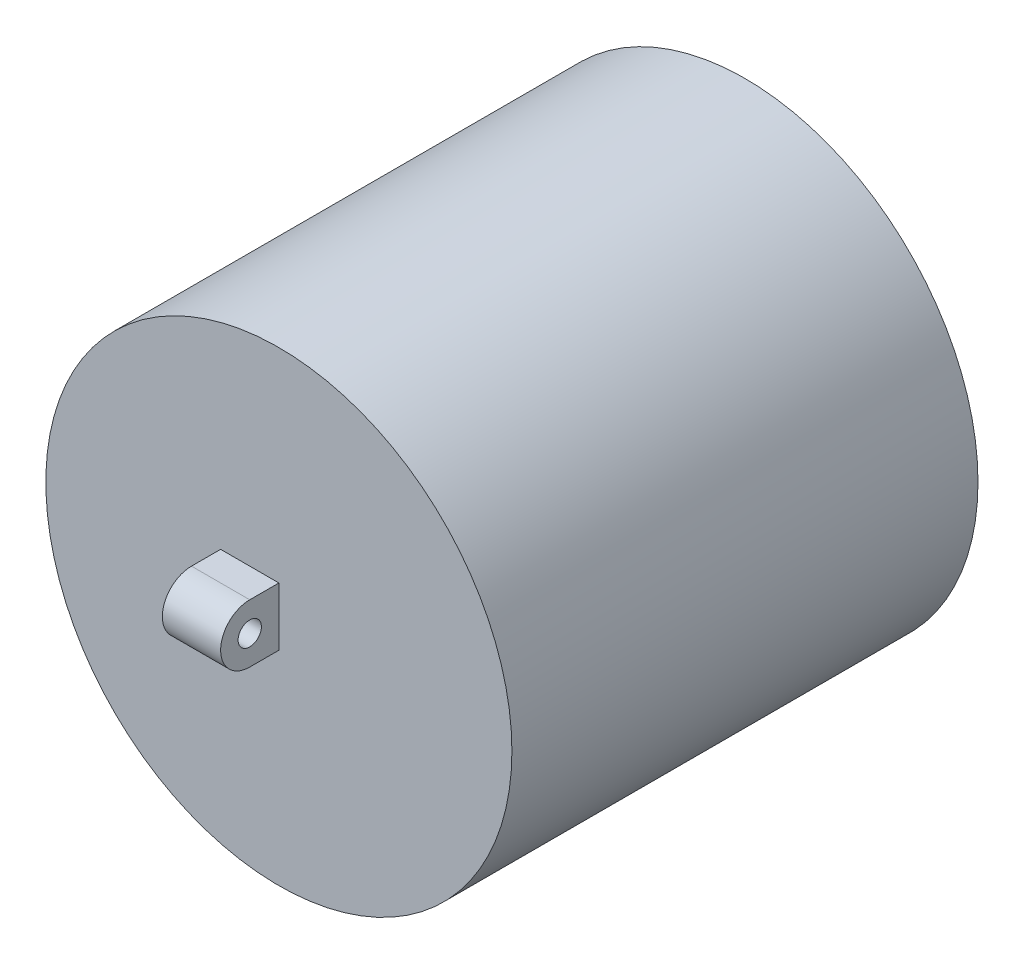
ISO-10303-21;
HEADER;
FILE_DESCRIPTION(('STEP AP214'),'2;1');
FILE_NAME('part.step','',(''),(''),'','','');
FILE_SCHEMA(('AUTOMOTIVE_DESIGN { 1 0 10303 214 1 1 1 1 }'));
ENDSEC;
DATA;
#1=APPLICATION_CONTEXT('core data for automotive mechanical design processes');
#2=APPLICATION_PROTOCOL_DEFINITION('international standard','automotive_design',2000,#1);
#3=PRODUCT_CONTEXT('',#1,'mechanical');
#4=PRODUCT('Part','Part','',(#3));
#5=PRODUCT_RELATED_PRODUCT_CATEGORY('part','',(#4));
#6=PRODUCT_DEFINITION_FORMATION('','',#4);
#7=PRODUCT_DEFINITION_CONTEXT('part definition',#1,'design');
#8=PRODUCT_DEFINITION('design','',#6,#7);
#9=PRODUCT_DEFINITION_SHAPE('','',#8);
#10=(LENGTH_UNIT() NAMED_UNIT(*) SI_UNIT(.MILLI.,.METRE.));
#11=(NAMED_UNIT(*) PLANE_ANGLE_UNIT() SI_UNIT($,.RADIAN.));
#12=(NAMED_UNIT(*) SI_UNIT($,.STERADIAN.) SOLID_ANGLE_UNIT());
#13=UNCERTAINTY_MEASURE_WITH_UNIT(LENGTH_MEASURE(1.E-05),#10,'distance_accuracy_value','');
#14=(GEOMETRIC_REPRESENTATION_CONTEXT(3) GLOBAL_UNCERTAINTY_ASSIGNED_CONTEXT((#13)) GLOBAL_UNIT_ASSIGNED_CONTEXT((#10,
#11,#12)) REPRESENTATION_CONTEXT('',''));
#15=CARTESIAN_POINT('',(0.,0.,0.));
#16=DIRECTION('',(0.,0.,1.));
#17=DIRECTION('',(1.,0.,0.));
#18=AXIS2_PLACEMENT_3D('',#15,#16,#17);
#19=CARTESIAN_POINT('',(-3.175,-1.5875,28.575));
#20=DIRECTION('',(0.,1.,0.));
#21=DIRECTION('',(0.,0.,1.));
#22=AXIS2_PLACEMENT_3D('',#19,#20,#21);
#23=PLANE('',#22);
#24=DIRECTION('',(1.,0.,0.));
#25=VECTOR('',#24,1.);
#26=CARTESIAN_POINT('',(-80.3943031699913,-1.58750000000003,26.9875));
#27=LINE('',#26,#25);
#28=CARTESIAN_POINT('',(-3.175,-1.5875,26.9875));
#29=VERTEX_POINT('',#28);
#30=CARTESIAN_POINT('',(0.,-1.5875,26.9875));
#31=VERTEX_POINT('',#30);
#32=EDGE_CURVE('E74',#29,#31,#27,.T.);
#33=ORIENTED_EDGE('',*,*,#32,.F.);
#34=DIRECTION('',(0.,0.,-1.));
#35=VECTOR('',#34,1.);
#36=CARTESIAN_POINT('',(-3.175,-1.5875,28.575));
#37=LINE('',#36,#35);
#38=CARTESIAN_POINT('',(-3.175,-1.5875,25.4));
#39=VERTEX_POINT('',#38);
#40=EDGE_CURVE('E54',#29,#39,#37,.T.);
#41=ORIENTED_EDGE('',*,*,#40,.T.);
#42=DIRECTION('',(1.,0.,0.));
#43=VECTOR('',#42,1.);
#44=CARTESIAN_POINT('',(-3.175,-1.5875,25.4));
#45=LINE('',#44,#43);
#46=CARTESIAN_POINT('',(0.,-1.5875,25.4));
#47=VERTEX_POINT('',#46);
#48=EDGE_CURVE('E147',#39,#47,#45,.T.);
#49=ORIENTED_EDGE('',*,*,#48,.T.);
#50=DIRECTION('',(0.,0.,-1.));
#51=VECTOR('',#50,1.);
#52=CARTESIAN_POINT('',(0.,-1.5875,28.575));
#53=LINE('',#52,#51);
#54=EDGE_CURVE('E82',#31,#47,#53,.T.);
#55=ORIENTED_EDGE('',*,*,#54,.F.);
#56=EDGE_LOOP('',(#33,#41,#49,#55));
#57=FACE_BOUND('',#56,.T.);
#58=ADVANCED_FACE('F32',(#57),#23,.F.);
#59=CARTESIAN_POINT('',(0.,1.5875,28.575));
#60=DIRECTION('',(-1.,0.,0.));
#61=DIRECTION('',(0.,0.,1.));
#62=AXIS2_PLACEMENT_3D('',#59,#60,#61);
#63=PLANE('',#62);
#64=CARTESIAN_POINT('',(0.,0.,26.9875));
#65=DIRECTION('',(1.,0.,0.));
#66=DIRECTION('',(0.,0.,-1.));
#67=AXIS2_PLACEMENT_3D('',#64,#65,#66);
#68=CIRCLE('',#67,0.634999999999999);
#69=CARTESIAN_POINT('',(0.,0.,26.3525));
#70=VERTEX_POINT('',#69);
#71=EDGE_CURVE('E140',#70,#70,#68,.T.);
#72=ORIENTED_EDGE('',*,*,#71,.F.);
#73=EDGE_LOOP('',(#72));
#74=FACE_BOUND('',#73,.T.);
#75=CARTESIAN_POINT('',(0.,0.,26.9875));
#76=DIRECTION('',(1.,0.,0.));
#77=DIRECTION('',(0.,1.,0.));
#78=AXIS2_PLACEMENT_3D('',#75,#76,#77);
#79=CIRCLE('',#78,1.5875);
#80=CARTESIAN_POINT('',(0.,1.5875,26.9875));
#81=VERTEX_POINT('',#80);
#82=EDGE_CURVE('E79',#31,#81,#79,.F.);
#83=ORIENTED_EDGE('',*,*,#82,.F.);
#84=ORIENTED_EDGE('',*,*,#54,.T.);
#85=DIRECTION('',(0.,1.,0.));
#86=VECTOR('',#85,1.);
#87=CARTESIAN_POINT('',(0.,1.5875,25.4));
#88=LINE('',#87,#86);
#89=CARTESIAN_POINT('',(0.,1.5875,25.4));
#90=VERTEX_POINT('',#89);
#91=EDGE_CURVE('E149',#47,#90,#88,.T.);
#92=ORIENTED_EDGE('',*,*,#91,.T.);
#93=DIRECTION('',(0.,0.,-1.));
#94=VECTOR('',#93,1.);
#95=CARTESIAN_POINT('',(0.,1.5875,28.575));
#96=LINE('',#95,#94);
#97=EDGE_CURVE('E90',#81,#90,#96,.T.);
#98=ORIENTED_EDGE('',*,*,#97,.F.);
#99=EDGE_LOOP('',(#83,#84,#92,#98));
#100=FACE_BOUND('',#99,.T.);
#101=ADVANCED_FACE('F117',(#74,#100),#63,.F.);
#102=CARTESIAN_POINT('',(0.,0.,25.4));
#103=DIRECTION('',(0.,0.,-1.));
#104=DIRECTION('',(-1.,0.,0.));
#105=AXIS2_PLACEMENT_3D('',#102,#103,#104);
#106=CYLINDRICAL_SURFACE('',#105,12.7);
#107=CARTESIAN_POINT('',(0.,0.,25.4));
#108=DIRECTION('',(0.,0.,1.));
#109=DIRECTION('',(1.,0.,0.));
#110=AXIS2_PLACEMENT_3D('',#107,#108,#109);
#111=CIRCLE('',#110,12.7);
#112=CARTESIAN_POINT('',(12.7,0.,25.4));
#113=VERTEX_POINT('',#112);
#114=EDGE_CURVE('E11',#113,#113,#111,.T.);
#115=ORIENTED_EDGE('',*,*,#114,.F.);
#116=EDGE_LOOP('',(#115));
#117=FACE_BOUND('',#116,.T.);
#118=CARTESIAN_POINT('',(0.,0.,0.));
#119=DIRECTION('',(0.,0.,1.));
#120=DIRECTION('',(1.,0.,0.));
#121=AXIS2_PLACEMENT_3D('',#118,#119,#120);
#122=CIRCLE('',#121,12.7);
#123=CARTESIAN_POINT('',(12.7,0.,0.));
#124=VERTEX_POINT('',#123);
#125=EDGE_CURVE('E36',#124,#124,#122,.T.);
#126=ORIENTED_EDGE('',*,*,#125,.T.);
#127=EDGE_LOOP('',(#126));
#128=FACE_BOUND('',#127,.T.);
#129=ADVANCED_FACE('F34',(#117,#128),#106,.T.);
#130=CARTESIAN_POINT('',(0.,0.,25.4));
#131=DIRECTION('',(0.,0.,1.));
#132=DIRECTION('',(1.,0.,0.));
#133=AXIS2_PLACEMENT_3D('',#130,#131,#132);
#134=PLANE('',#133);
#135=ORIENTED_EDGE('',*,*,#48,.F.);
#136=DIRECTION('',(0.,-1.,0.));
#137=VECTOR('',#136,1.);
#138=CARTESIAN_POINT('',(-3.175,1.5875,25.4));
#139=LINE('',#138,#137);
#140=CARTESIAN_POINT('',(-3.175,1.5875,25.4));
#141=VERTEX_POINT('',#140);
#142=EDGE_CURVE('E87',#141,#39,#139,.T.);
#143=ORIENTED_EDGE('',*,*,#142,.F.);
#144=DIRECTION('',(-1.,0.,0.));
#145=VECTOR('',#144,1.);
#146=CARTESIAN_POINT('',(0.,1.5875,25.4));
#147=LINE('',#146,#145);
#148=EDGE_CURVE('E92',#90,#141,#147,.T.);
#149=ORIENTED_EDGE('',*,*,#148,.F.);
#150=ORIENTED_EDGE('',*,*,#91,.F.);
#151=EDGE_LOOP('',(#135,#143,#149,#150));
#152=FACE_BOUND('',#151,.T.);
#153=ORIENTED_EDGE('',*,*,#114,.T.);
#154=EDGE_LOOP('',(#153));
#155=FACE_BOUND('',#154,.T.);
#156=ADVANCED_FACE('F107',(#152,#155),#134,.T.);
#157=CARTESIAN_POINT('',(0.,0.,0.));
#158=DIRECTION('',(0.,0.,1.));
#159=DIRECTION('',(1.,0.,0.));
#160=AXIS2_PLACEMENT_3D('',#157,#158,#159);
#161=PLANE('',#160);
#162=ORIENTED_EDGE('',*,*,#125,.F.);
#163=EDGE_LOOP('',(#162));
#164=FACE_BOUND('',#163,.T.);
#165=ADVANCED_FACE('F104',(#164),#161,.F.);
#166=CARTESIAN_POINT('',(0.,1.5875,28.575));
#167=DIRECTION('',(0.,-1.,0.));
#168=DIRECTION('',(0.,0.,-1.));
#169=AXIS2_PLACEMENT_3D('',#166,#167,#168);
#170=PLANE('',#169);
#171=DIRECTION('',(0.,0.,-1.));
#172=VECTOR('',#171,1.);
#173=CARTESIAN_POINT('',(-3.175,1.5875,28.575));
#174=LINE('',#173,#172);
#175=CARTESIAN_POINT('',(-3.175,1.5875,26.9875));
#176=VERTEX_POINT('',#175);
#177=EDGE_CURVE('E88',#176,#141,#174,.T.);
#178=ORIENTED_EDGE('',*,*,#177,.F.);
#179=DIRECTION('',(1.,0.,0.));
#180=VECTOR('',#179,1.);
#181=CARTESIAN_POINT('',(-80.3943031699913,1.58749999999997,26.9875));
#182=LINE('',#181,#180);
#183=EDGE_CURVE('E77',#176,#81,#182,.T.);
#184=ORIENTED_EDGE('',*,*,#183,.T.);
#185=ORIENTED_EDGE('',*,*,#97,.T.);
#186=ORIENTED_EDGE('',*,*,#148,.T.);
#187=EDGE_LOOP('',(#178,#184,#185,#186));
#188=FACE_BOUND('',#187,.T.);
#189=ADVANCED_FACE('F106',(#188),#170,.F.);
#190=CARTESIAN_POINT('',(-3.175,1.5875,28.575));
#191=DIRECTION('',(1.,0.,0.));
#192=DIRECTION('',(0.,1.,0.));
#193=AXIS2_PLACEMENT_3D('',#190,#191,#192);
#194=PLANE('',#193);
#195=ORIENTED_EDGE('',*,*,#40,.F.);
#196=CARTESIAN_POINT('',(-3.175,0.,26.9875));
#197=DIRECTION('',(1.,0.,0.));
#198=DIRECTION('',(0.,1.,0.));
#199=AXIS2_PLACEMENT_3D('',#196,#197,#198);
#200=CIRCLE('',#199,1.5875);
#201=EDGE_CURVE('E47',#29,#176,#200,.F.);
#202=ORIENTED_EDGE('',*,*,#201,.T.);
#203=ORIENTED_EDGE('',*,*,#177,.T.);
#204=ORIENTED_EDGE('',*,*,#142,.T.);
#205=EDGE_LOOP('',(#195,#202,#203,#204));
#206=FACE_BOUND('',#205,.T.);
#207=ADVANCED_FACE('F85',(#206),#194,.F.);
#208=CARTESIAN_POINT('',(-80.3943031699913,0.,26.9875));
#209=DIRECTION('',(1.,0.,0.));
#210=DIRECTION('',(0.,1.,0.));
#211=AXIS2_PLACEMENT_3D('',#208,#209,#210);
#212=CYLINDRICAL_SURFACE('',#211,1.5875);
#213=ORIENTED_EDGE('',*,*,#183,.F.);
#214=ORIENTED_EDGE('',*,*,#201,.F.);
#215=ORIENTED_EDGE('',*,*,#32,.T.);
#216=ORIENTED_EDGE('',*,*,#82,.T.);
#217=EDGE_LOOP('',(#213,#214,#215,#216));
#218=FACE_BOUND('',#217,.T.);
#219=ADVANCED_FACE('F73',(#218),#212,.T.);
#220=CARTESIAN_POINT('',(-2.54,0.,26.9875));
#221=DIRECTION('',(1.,0.,0.));
#222=DIRECTION('',(0.,0.,-1.));
#223=AXIS2_PLACEMENT_3D('',#220,#221,#222);
#224=CYLINDRICAL_SURFACE('',#223,0.634999999999999);
#225=CARTESIAN_POINT('',(-2.54,0.,26.9875));
#226=DIRECTION('',(1.,0.,0.));
#227=DIRECTION('',(0.,0.,-1.));
#228=AXIS2_PLACEMENT_3D('',#225,#226,#227);
#229=CIRCLE('',#228,0.634999999999999);
#230=CARTESIAN_POINT('',(-2.54,0.,26.3525));
#231=VERTEX_POINT('',#230);
#232=EDGE_CURVE('E80',#231,#231,#229,.T.);
#233=ORIENTED_EDGE('',*,*,#232,.F.);
#234=EDGE_LOOP('',(#233));
#235=FACE_BOUND('',#234,.T.);
#236=ORIENTED_EDGE('',*,*,#71,.T.);
#237=EDGE_LOOP('',(#236));
#238=FACE_BOUND('',#237,.T.);
#239=ADVANCED_FACE('F129',(#235,#238),#224,.F.);
#240=CARTESIAN_POINT('',(-2.54,0.,26.9875));
#241=DIRECTION('',(1.,0.,0.));
#242=DIRECTION('',(0.,0.,-1.));
#243=AXIS2_PLACEMENT_3D('',#240,#241,#242);
#244=PLANE('',#243);
#245=ORIENTED_EDGE('',*,*,#232,.T.);
#246=EDGE_LOOP('',(#245));
#247=FACE_BOUND('',#246,.T.);
#248=ADVANCED_FACE('F132',(#247),#244,.T.);
#249=CLOSED_SHELL('',(#58,#101,#129,#156,#165,#189,#207,#219,#239,#248));
#250=MANIFOLD_SOLID_BREP('B2',#249);
#251=ADVANCED_BREP_SHAPE_REPRESENTATION('',(#18,#250),#14);
#252=SHAPE_DEFINITION_REPRESENTATION(#9,#251);
ENDSEC;
END-ISO-10303-21;
